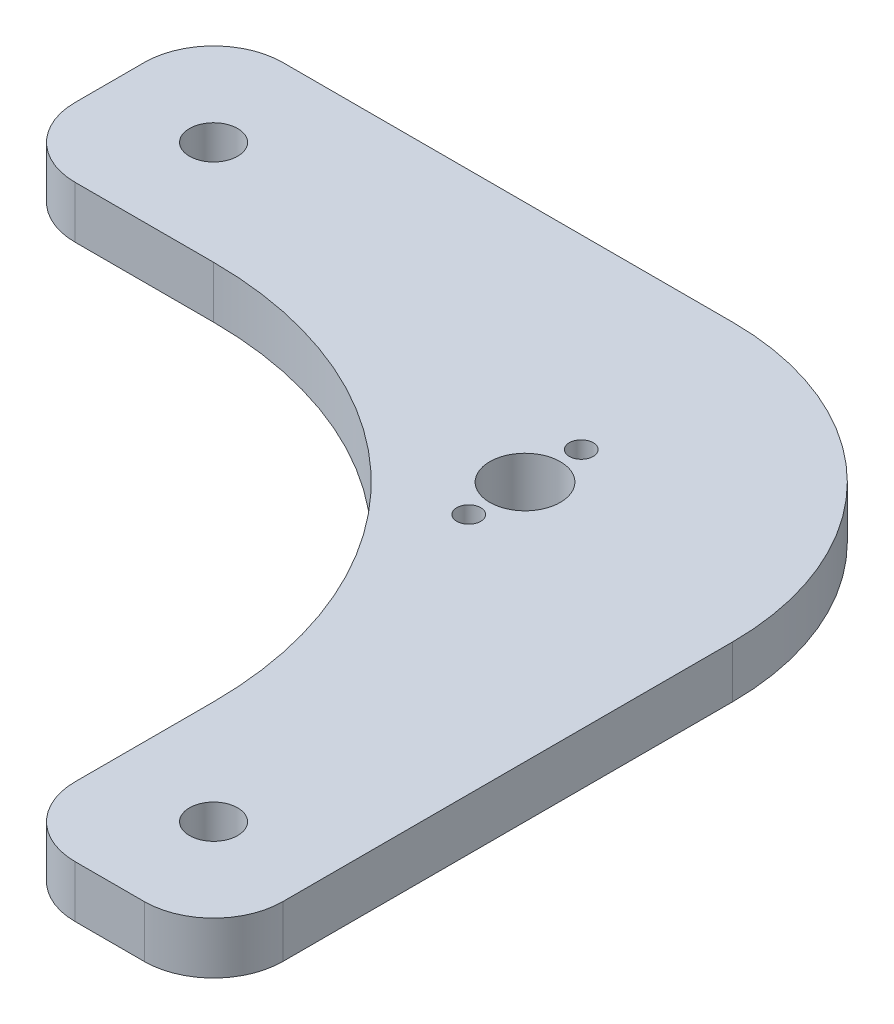
ISO-10303-21;
HEADER;
FILE_DESCRIPTION(('STEP AP214'),'2;1');
FILE_NAME('part.step','',(''),(''),'','','');
FILE_SCHEMA(('AUTOMOTIVE_DESIGN { 1 0 10303 214 1 1 1 1 }'));
ENDSEC;
DATA;
#1=APPLICATION_CONTEXT('core data for automotive mechanical design processes');
#2=APPLICATION_PROTOCOL_DEFINITION('international standard','automotive_design',2000,#1);
#3=PRODUCT_CONTEXT('',#1,'mechanical');
#4=PRODUCT('Part','Part','',(#3));
#5=PRODUCT_RELATED_PRODUCT_CATEGORY('part','',(#4));
#6=PRODUCT_DEFINITION_FORMATION('','',#4);
#7=PRODUCT_DEFINITION_CONTEXT('part definition',#1,'design');
#8=PRODUCT_DEFINITION('design','',#6,#7);
#9=PRODUCT_DEFINITION_SHAPE('','',#8);
#10=(LENGTH_UNIT() NAMED_UNIT(*) SI_UNIT(.MILLI.,.METRE.));
#11=(NAMED_UNIT(*) PLANE_ANGLE_UNIT() SI_UNIT($,.RADIAN.));
#12=(NAMED_UNIT(*) SI_UNIT($,.STERADIAN.) SOLID_ANGLE_UNIT());
#13=UNCERTAINTY_MEASURE_WITH_UNIT(LENGTH_MEASURE(1.E-05),#10,'distance_accuracy_value','');
#14=(GEOMETRIC_REPRESENTATION_CONTEXT(3) GLOBAL_UNCERTAINTY_ASSIGNED_CONTEXT((#13)) GLOBAL_UNIT_ASSIGNED_CONTEXT((#10,
#11,#12)) REPRESENTATION_CONTEXT('',''));
#15=CARTESIAN_POINT('',(0.,0.,0.));
#16=DIRECTION('',(0.,0.,1.));
#17=DIRECTION('',(1.,0.,0.));
#18=AXIS2_PLACEMENT_3D('',#15,#16,#17);
#19=CARTESIAN_POINT('',(0.,4.7625,0.));
#20=DIRECTION('',(0.,0.,-1.));
#21=DIRECTION('',(-1.,0.,0.));
#22=AXIS2_PLACEMENT_3D('',#19,#20,#21);
#23=PLANE('',#22);
#24=DIRECTION('',(1.,0.,0.));
#25=VECTOR('',#24,1.);
#26=CARTESIAN_POINT('',(0.,4.7625,0.));
#27=LINE('',#26,#25);
#28=CARTESIAN_POINT('',(120.65,4.7625,0.));
#29=VERTEX_POINT('',#28);
#30=CARTESIAN_POINT('',(133.35,4.7625,0.));
#31=VERTEX_POINT('',#30);
#32=EDGE_CURVE('E188',#29,#31,#27,.T.);
#33=ORIENTED_EDGE('',*,*,#32,.F.);
#34=DIRECTION('',(0.,1.,0.));
#35=VECTOR('',#34,1.);
#36=CARTESIAN_POINT('',(120.65,4.7625,0.));
#37=LINE('',#36,#35);
#38=CARTESIAN_POINT('',(120.65,-4.7625,0.));
#39=VERTEX_POINT('',#38);
#40=EDGE_CURVE('E220',#29,#39,#37,.F.);
#41=ORIENTED_EDGE('',*,*,#40,.T.);
#42=DIRECTION('',(1.,0.,0.));
#43=VECTOR('',#42,1.);
#44=CARTESIAN_POINT('',(0.,-4.7625,0.));
#45=LINE('',#44,#43);
#46=CARTESIAN_POINT('',(133.35,-4.7625,0.));
#47=VERTEX_POINT('',#46);
#48=EDGE_CURVE('E185',#39,#47,#45,.T.);
#49=ORIENTED_EDGE('',*,*,#48,.T.);
#50=DIRECTION('',(0.,-1.,0.));
#51=VECTOR('',#50,1.);
#52=CARTESIAN_POINT('',(133.35,4.7625,0.));
#53=LINE('',#52,#51);
#54=EDGE_CURVE('E218',#47,#31,#53,.F.);
#55=ORIENTED_EDGE('',*,*,#54,.T.);
#56=EDGE_LOOP('',(#33,#41,#49,#55));
#57=FACE_BOUND('',#56,.T.);
#58=ADVANCED_FACE('F34',(#57),#23,.F.);
#59=CARTESIAN_POINT('',(146.05,4.7625,-146.05));
#60=DIRECTION('',(-1.,0.,0.));
#61=DIRECTION('',(0.,0.,1.));
#62=AXIS2_PLACEMENT_3D('',#59,#60,#61);
#63=PLANE('',#62);
#64=DIRECTION('',(0.,0.,-1.));
#65=VECTOR('',#64,1.);
#66=CARTESIAN_POINT('',(146.05,-4.7625,-146.05));
#67=LINE('',#66,#65);
#68=CARTESIAN_POINT('',(146.05,-4.7625,-12.7));
#69=VERTEX_POINT('',#68);
#70=CARTESIAN_POINT('',(146.05,-4.7625,-95.25));
#71=VERTEX_POINT('',#70);
#72=EDGE_CURVE('E202',#69,#71,#67,.T.);
#73=ORIENTED_EDGE('',*,*,#72,.T.);
#74=DIRECTION('',(0.,-1.,0.));
#75=VECTOR('',#74,1.);
#76=CARTESIAN_POINT('',(146.05,4.7625,-95.25));
#77=LINE('',#76,#75);
#78=CARTESIAN_POINT('',(146.05,4.7625,-95.25));
#79=VERTEX_POINT('',#78);
#80=EDGE_CURVE('E42',#71,#79,#77,.F.);
#81=ORIENTED_EDGE('',*,*,#80,.T.);
#82=DIRECTION('',(0.,0.,-1.));
#83=VECTOR('',#82,1.);
#84=CARTESIAN_POINT('',(146.05,4.7625,-146.05));
#85=LINE('',#84,#83);
#86=CARTESIAN_POINT('',(146.05,4.7625,-12.7));
#87=VERTEX_POINT('',#86);
#88=EDGE_CURVE('E191',#87,#79,#85,.T.);
#89=ORIENTED_EDGE('',*,*,#88,.F.);
#90=DIRECTION('',(0.,-1.,0.));
#91=VECTOR('',#90,1.);
#92=CARTESIAN_POINT('',(146.05,4.7625,-12.7));
#93=LINE('',#92,#91);
#94=EDGE_CURVE('E241',#87,#69,#93,.T.);
#95=ORIENTED_EDGE('',*,*,#94,.T.);
#96=EDGE_LOOP('',(#73,#81,#89,#95));
#97=FACE_BOUND('',#96,.T.);
#98=ADVANCED_FACE('F283',(#97),#63,.F.);
#99=CARTESIAN_POINT('',(0.,4.7625,-146.05));
#100=DIRECTION('',(0.,0.,1.));
#101=DIRECTION('',(1.,0.,0.));
#102=AXIS2_PLACEMENT_3D('',#99,#100,#101);
#103=PLANE('',#102);
#104=DIRECTION('',(-1.,0.,0.));
#105=VECTOR('',#104,1.);
#106=CARTESIAN_POINT('',(0.,4.7625,-146.05));
#107=LINE('',#106,#105);
#108=CARTESIAN_POINT('',(95.25,4.7625,-146.05));
#109=VERTEX_POINT('',#108);
#110=CARTESIAN_POINT('',(12.7,4.7625,-146.05));
#111=VERTEX_POINT('',#110);
#112=EDGE_CURVE('E194',#109,#111,#107,.T.);
#113=ORIENTED_EDGE('',*,*,#112,.F.);
#114=DIRECTION('',(0.,-1.,0.));
#115=VECTOR('',#114,1.);
#116=CARTESIAN_POINT('',(95.25,4.7625,-146.05));
#117=LINE('',#116,#115);
#118=CARTESIAN_POINT('',(95.25,-4.7625,-146.05));
#119=VERTEX_POINT('',#118);
#120=EDGE_CURVE('E244',#109,#119,#117,.T.);
#121=ORIENTED_EDGE('',*,*,#120,.T.);
#122=DIRECTION('',(-1.,0.,0.));
#123=VECTOR('',#122,1.);
#124=CARTESIAN_POINT('',(0.,-4.7625,-146.05));
#125=LINE('',#124,#123);
#126=CARTESIAN_POINT('',(12.7,-4.7625,-146.05));
#127=VERTEX_POINT('',#126);
#128=EDGE_CURVE('E204',#119,#127,#125,.T.);
#129=ORIENTED_EDGE('',*,*,#128,.T.);
#130=DIRECTION('',(0.,-1.,0.));
#131=VECTOR('',#130,1.);
#132=CARTESIAN_POINT('',(12.7,4.7625,-146.05));
#133=LINE('',#132,#131);
#134=EDGE_CURVE('E238',#127,#111,#133,.F.);
#135=ORIENTED_EDGE('',*,*,#134,.T.);
#136=EDGE_LOOP('',(#113,#121,#129,#135));
#137=FACE_BOUND('',#136,.T.);
#138=ADVANCED_FACE('F250',(#137),#103,.F.);
#139=CARTESIAN_POINT('',(0.,4.7625,-146.05));
#140=DIRECTION('',(1.,0.,0.));
#141=DIRECTION('',(0.,0.,-1.));
#142=AXIS2_PLACEMENT_3D('',#139,#140,#141);
#143=PLANE('',#142);
#144=DIRECTION('',(0.,0.,1.));
#145=VECTOR('',#144,1.);
#146=CARTESIAN_POINT('',(0.,-4.7625,-146.05));
#147=LINE('',#146,#145);
#148=CARTESIAN_POINT('',(0.,-4.7625,-133.35));
#149=VERTEX_POINT('',#148);
#150=CARTESIAN_POINT('',(0.,-4.7625,-120.65));
#151=VERTEX_POINT('',#150);
#152=EDGE_CURVE('E192',#149,#151,#147,.T.);
#153=ORIENTED_EDGE('',*,*,#152,.T.);
#154=DIRECTION('',(0.,1.,0.));
#155=VECTOR('',#154,1.);
#156=CARTESIAN_POINT('',(0.,4.7625,-120.65));
#157=LINE('',#156,#155);
#158=CARTESIAN_POINT('',(0.,4.7625,-120.65));
#159=VERTEX_POINT('',#158);
#160=EDGE_CURVE('E234',#151,#159,#157,.T.);
#161=ORIENTED_EDGE('',*,*,#160,.T.);
#162=DIRECTION('',(0.,0.,1.));
#163=VECTOR('',#162,1.);
#164=CARTESIAN_POINT('',(0.,4.7625,-146.05));
#165=LINE('',#164,#163);
#166=CARTESIAN_POINT('',(0.,4.7625,-133.35));
#167=VERTEX_POINT('',#166);
#168=EDGE_CURVE('E196',#167,#159,#165,.T.);
#169=ORIENTED_EDGE('',*,*,#168,.F.);
#170=DIRECTION('',(0.,-1.,0.));
#171=VECTOR('',#170,1.);
#172=CARTESIAN_POINT('',(0.,4.7625,-133.35));
#173=LINE('',#172,#171);
#174=EDGE_CURVE('E231',#167,#149,#173,.T.);
#175=ORIENTED_EDGE('',*,*,#174,.T.);
#176=EDGE_LOOP('',(#153,#161,#169,#175));
#177=FACE_BOUND('',#176,.T.);
#178=ADVANCED_FACE('F263',(#177),#143,.F.);
#179=CARTESIAN_POINT('',(0.,4.7625,0.));
#180=DIRECTION('',(0.,-1.,0.));
#181=DIRECTION('',(0.,0.,-1.));
#182=AXIS2_PLACEMENT_3D('',#179,#180,#181);
#183=PLANE('',#182);
#184=CARTESIAN_POINT('',(19.05,4.7625,-127.));
#185=DIRECTION('',(0.,1.,0.));
#186=DIRECTION('',(0.,0.,1.));
#187=AXIS2_PLACEMENT_3D('',#184,#185,#186);
#188=CIRCLE('',#187,4.4196);
#189=CARTESIAN_POINT('',(19.05,4.7625,-122.5804));
#190=VERTEX_POINT('',#189);
#191=EDGE_CURVE('E135',#190,#190,#188,.T.);
#192=ORIENTED_EDGE('',*,*,#191,.F.);
#193=EDGE_LOOP('',(#192));
#194=FACE_BOUND('',#193,.T.);
#195=CARTESIAN_POINT('',(127.,4.7625,-19.05));
#196=DIRECTION('',(0.,1.,0.));
#197=DIRECTION('',(0.,0.,1.));
#198=AXIS2_PLACEMENT_3D('',#195,#196,#197);
#199=CIRCLE('',#198,4.4196);
#200=CARTESIAN_POINT('',(127.,4.7625,-14.6304));
#201=VERTEX_POINT('',#200);
#202=EDGE_CURVE('E163',#201,#201,#199,.T.);
#203=ORIENTED_EDGE('',*,*,#202,.F.);
#204=EDGE_LOOP('',(#203));
#205=FACE_BOUND('',#204,.T.);
#206=CARTESIAN_POINT('',(101.6,4.7625,-91.28125));
#207=DIRECTION('',(0.,1.,0.));
#208=DIRECTION('',(0.,0.,1.));
#209=AXIS2_PLACEMENT_3D('',#206,#207,#208);
#210=CIRCLE('',#209,2.19075000000001);
#211=CARTESIAN_POINT('',(101.6,4.7625,-89.0905));
#212=VERTEX_POINT('',#211);
#213=EDGE_CURVE('E174',#212,#212,#210,.T.);
#214=ORIENTED_EDGE('',*,*,#213,.F.);
#215=EDGE_LOOP('',(#214));
#216=FACE_BOUND('',#215,.T.);
#217=CARTESIAN_POINT('',(101.6,4.7625,-111.91875));
#218=DIRECTION('',(0.,1.,0.));
#219=DIRECTION('',(0.,0.,1.));
#220=AXIS2_PLACEMENT_3D('',#217,#218,#219);
#221=CIRCLE('',#220,2.19075000000001);
#222=CARTESIAN_POINT('',(101.6,4.7625,-109.728));
#223=VERTEX_POINT('',#222);
#224=EDGE_CURVE('E169',#223,#223,#221,.T.);
#225=ORIENTED_EDGE('',*,*,#224,.F.);
#226=EDGE_LOOP('',(#225));
#227=FACE_BOUND('',#226,.T.);
#228=CARTESIAN_POINT('',(101.6,4.7625,-101.6));
#229=DIRECTION('',(0.,1.,0.));
#230=DIRECTION('',(0.,0.,1.));
#231=AXIS2_PLACEMENT_3D('',#228,#229,#230);
#232=CIRCLE('',#231,6.477);
#233=CARTESIAN_POINT('',(101.6,4.7625,-95.123));
#234=VERTEX_POINT('',#233);
#235=EDGE_CURVE('E173',#234,#234,#232,.T.);
#236=ORIENTED_EDGE('',*,*,#235,.F.);
#237=EDGE_LOOP('',(#236));
#238=FACE_BOUND('',#237,.T.);
#239=ORIENTED_EDGE('',*,*,#88,.T.);
#240=CARTESIAN_POINT('',(95.25,4.7625,-95.25));
#241=DIRECTION('',(0.,-1.,0.));
#242=DIRECTION('',(0.,0.,-1.));
#243=AXIS2_PLACEMENT_3D('',#240,#241,#242);
#244=CIRCLE('',#243,50.8);
#245=EDGE_CURVE('E11',#79,#109,#244,.F.);
#246=ORIENTED_EDGE('',*,*,#245,.T.);
#247=ORIENTED_EDGE('',*,*,#112,.T.);
#248=CARTESIAN_POINT('',(12.7,4.7625,-133.35));
#249=DIRECTION('',(0.,-1.,0.));
#250=DIRECTION('',(0.,0.,-1.));
#251=AXIS2_PLACEMENT_3D('',#248,#249,#250);
#252=CIRCLE('',#251,12.7);
#253=EDGE_CURVE('E212',#111,#167,#252,.F.);
#254=ORIENTED_EDGE('',*,*,#253,.T.);
#255=ORIENTED_EDGE('',*,*,#168,.T.);
#256=CARTESIAN_POINT('',(12.7,4.7625,-120.65));
#257=DIRECTION('',(0.,-1.,0.));
#258=DIRECTION('',(0.,0.,-1.));
#259=AXIS2_PLACEMENT_3D('',#256,#257,#258);
#260=CIRCLE('',#259,12.7);
#261=CARTESIAN_POINT('',(12.7,4.7625,-107.95));
#262=VERTEX_POINT('',#261);
#263=EDGE_CURVE('E214',#159,#262,#260,.F.);
#264=ORIENTED_EDGE('',*,*,#263,.T.);
#265=DIRECTION('',(-1.,0.,0.));
#266=VECTOR('',#265,1.);
#267=CARTESIAN_POINT('',(0.,4.7625,-107.95));
#268=LINE('',#267,#266);
#269=CARTESIAN_POINT('',(38.1,4.7625,-107.95));
#270=VERTEX_POINT('',#269);
#271=EDGE_CURVE('E150',#270,#262,#268,.T.);
#272=ORIENTED_EDGE('',*,*,#271,.F.);
#273=CARTESIAN_POINT('',(38.1,4.7625,-38.1));
#274=DIRECTION('',(0.,1.,0.));
#275=DIRECTION('',(0.,0.,-1.));
#276=AXIS2_PLACEMENT_3D('',#273,#274,#275);
#277=CIRCLE('',#276,69.85);
#278=CARTESIAN_POINT('',(107.95,4.7625,-38.1));
#279=VERTEX_POINT('',#278);
#280=EDGE_CURVE('E131',#279,#270,#277,.T.);
#281=ORIENTED_EDGE('',*,*,#280,.F.);
#282=DIRECTION('',(0.,0.,-1.));
#283=VECTOR('',#282,1.);
#284=CARTESIAN_POINT('',(107.95,4.7625,0.));
#285=LINE('',#284,#283);
#286=CARTESIAN_POINT('',(107.95,4.7625,-12.7));
#287=VERTEX_POINT('',#286);
#288=EDGE_CURVE('E153',#287,#279,#285,.T.);
#289=ORIENTED_EDGE('',*,*,#288,.F.);
#290=CARTESIAN_POINT('',(120.65,4.7625,-12.7));
#291=DIRECTION('',(0.,-1.,0.));
#292=DIRECTION('',(0.,0.,-1.));
#293=AXIS2_PLACEMENT_3D('',#290,#291,#292);
#294=CIRCLE('',#293,12.7);
#295=EDGE_CURVE('E216',#287,#29,#294,.F.);
#296=ORIENTED_EDGE('',*,*,#295,.T.);
#297=ORIENTED_EDGE('',*,*,#32,.T.);
#298=CARTESIAN_POINT('',(133.35,4.7625,-12.7));
#299=DIRECTION('',(0.,-1.,0.));
#300=DIRECTION('',(0.,0.,-1.));
#301=AXIS2_PLACEMENT_3D('',#298,#299,#300);
#302=CIRCLE('',#301,12.7);
#303=EDGE_CURVE('E210',#31,#87,#302,.F.);
#304=ORIENTED_EDGE('',*,*,#303,.T.);
#305=EDGE_LOOP('',(#239,#246,#247,#254,#255,#264,#272,#281,#289,#296,#297,#304));
#306=FACE_BOUND('',#305,.T.);
#307=ADVANCED_FACE('F261',(#194,#205,#216,#227,#238,#306),#183,.F.);
#308=CARTESIAN_POINT('',(0.,-4.7625,0.));
#309=DIRECTION('',(0.,-1.,0.));
#310=DIRECTION('',(0.,0.,-1.));
#311=AXIS2_PLACEMENT_3D('',#308,#309,#310);
#312=PLANE('',#311);
#313=ORIENTED_EDGE('',*,*,#128,.F.);
#314=CARTESIAN_POINT('',(95.25,-4.7625,-95.25));
#315=DIRECTION('',(0.,-1.,0.));
#316=DIRECTION('',(0.,0.,-1.));
#317=AXIS2_PLACEMENT_3D('',#314,#315,#316);
#318=CIRCLE('',#317,50.8);
#319=EDGE_CURVE('E56',#119,#71,#318,.T.);
#320=ORIENTED_EDGE('',*,*,#319,.T.);
#321=ORIENTED_EDGE('',*,*,#72,.F.);
#322=CARTESIAN_POINT('',(133.35,-4.7625,-12.7));
#323=DIRECTION('',(0.,-1.,0.));
#324=DIRECTION('',(0.,0.,-1.));
#325=AXIS2_PLACEMENT_3D('',#322,#323,#324);
#326=CIRCLE('',#325,12.7);
#327=EDGE_CURVE('E222',#69,#47,#326,.T.);
#328=ORIENTED_EDGE('',*,*,#327,.T.);
#329=ORIENTED_EDGE('',*,*,#48,.F.);
#330=CARTESIAN_POINT('',(120.65,-4.7625,-12.7));
#331=DIRECTION('',(0.,-1.,0.));
#332=DIRECTION('',(0.,0.,-1.));
#333=AXIS2_PLACEMENT_3D('',#330,#331,#332);
#334=CIRCLE('',#333,12.7);
#335=CARTESIAN_POINT('',(107.95,-4.7625,-12.7));
#336=VERTEX_POINT('',#335);
#337=EDGE_CURVE('E229',#39,#336,#334,.T.);
#338=ORIENTED_EDGE('',*,*,#337,.T.);
#339=DIRECTION('',(0.,0.,-1.));
#340=VECTOR('',#339,1.);
#341=CARTESIAN_POINT('',(107.95,-4.7625,0.));
#342=LINE('',#341,#340);
#343=CARTESIAN_POINT('',(107.95,-4.7625,-38.1));
#344=VERTEX_POINT('',#343);
#345=EDGE_CURVE('E148',#336,#344,#342,.T.);
#346=ORIENTED_EDGE('',*,*,#345,.T.);
#347=CARTESIAN_POINT('',(38.1,-4.7625,-38.1));
#348=DIRECTION('',(0.,1.,0.));
#349=DIRECTION('',(0.,0.,-1.));
#350=AXIS2_PLACEMENT_3D('',#347,#348,#349);
#351=CIRCLE('',#350,69.85);
#352=CARTESIAN_POINT('',(38.1,-4.7625,-107.95));
#353=VERTEX_POINT('',#352);
#354=EDGE_CURVE('E128',#344,#353,#351,.T.);
#355=ORIENTED_EDGE('',*,*,#354,.T.);
#356=DIRECTION('',(-1.,0.,0.));
#357=VECTOR('',#356,1.);
#358=CARTESIAN_POINT('',(0.,-4.7625,-107.95));
#359=LINE('',#358,#357);
#360=CARTESIAN_POINT('',(12.7,-4.7625,-107.95));
#361=VERTEX_POINT('',#360);
#362=EDGE_CURVE('E139',#353,#361,#359,.T.);
#363=ORIENTED_EDGE('',*,*,#362,.T.);
#364=CARTESIAN_POINT('',(12.7,-4.7625,-120.65));
#365=DIRECTION('',(0.,-1.,0.));
#366=DIRECTION('',(0.,0.,-1.));
#367=AXIS2_PLACEMENT_3D('',#364,#365,#366);
#368=CIRCLE('',#367,12.7);
#369=EDGE_CURVE('E227',#361,#151,#368,.T.);
#370=ORIENTED_EDGE('',*,*,#369,.T.);
#371=ORIENTED_EDGE('',*,*,#152,.F.);
#372=CARTESIAN_POINT('',(12.7,-4.7625,-133.35));
#373=DIRECTION('',(0.,-1.,0.));
#374=DIRECTION('',(0.,0.,-1.));
#375=AXIS2_PLACEMENT_3D('',#372,#373,#374);
#376=CIRCLE('',#375,12.7);
#377=EDGE_CURVE('E224',#149,#127,#376,.T.);
#378=ORIENTED_EDGE('',*,*,#377,.T.);
#379=EDGE_LOOP('',(#313,#320,#321,#328,#329,#338,#346,#355,#363,#370,#371,#378));
#380=FACE_BOUND('',#379,.T.);
#381=CARTESIAN_POINT('',(19.05,-4.7625,-127.));
#382=DIRECTION('',(0.,1.,0.));
#383=DIRECTION('',(0.,0.,1.));
#384=AXIS2_PLACEMENT_3D('',#381,#382,#383);
#385=CIRCLE('',#384,4.4196);
#386=CARTESIAN_POINT('',(19.05,-4.7625,-122.5804));
#387=VERTEX_POINT('',#386);
#388=EDGE_CURVE('E160',#387,#387,#385,.T.);
#389=ORIENTED_EDGE('',*,*,#388,.T.);
#390=EDGE_LOOP('',(#389));
#391=FACE_BOUND('',#390,.T.);
#392=CARTESIAN_POINT('',(127.,-4.7625,-19.05));
#393=DIRECTION('',(0.,1.,0.));
#394=DIRECTION('',(0.,0.,1.));
#395=AXIS2_PLACEMENT_3D('',#392,#393,#394);
#396=CIRCLE('',#395,4.4196);
#397=CARTESIAN_POINT('',(127.,-4.7625,-14.6304));
#398=VERTEX_POINT('',#397);
#399=EDGE_CURVE('E166',#398,#398,#396,.T.);
#400=ORIENTED_EDGE('',*,*,#399,.T.);
#401=EDGE_LOOP('',(#400));
#402=FACE_BOUND('',#401,.T.);
#403=CARTESIAN_POINT('',(101.6,-4.7625,-91.28125));
#404=DIRECTION('',(0.,1.,0.));
#405=DIRECTION('',(0.,0.,1.));
#406=AXIS2_PLACEMENT_3D('',#403,#404,#405);
#407=CIRCLE('',#406,2.19075000000001);
#408=CARTESIAN_POINT('',(101.6,-4.7625,-89.0905));
#409=VERTEX_POINT('',#408);
#410=EDGE_CURVE('E170',#409,#409,#407,.T.);
#411=ORIENTED_EDGE('',*,*,#410,.T.);
#412=EDGE_LOOP('',(#411));
#413=FACE_BOUND('',#412,.T.);
#414=CARTESIAN_POINT('',(101.6,-4.7625,-111.91875));
#415=DIRECTION('',(0.,1.,0.));
#416=DIRECTION('',(0.,0.,1.));
#417=AXIS2_PLACEMENT_3D('',#414,#415,#416);
#418=CIRCLE('',#417,2.19075000000001);
#419=CARTESIAN_POINT('',(101.6,-4.7625,-109.728));
#420=VERTEX_POINT('',#419);
#421=EDGE_CURVE('E177',#420,#420,#418,.T.);
#422=ORIENTED_EDGE('',*,*,#421,.T.);
#423=EDGE_LOOP('',(#422));
#424=FACE_BOUND('',#423,.T.);
#425=CARTESIAN_POINT('',(101.6,-4.7625,-101.6));
#426=DIRECTION('',(0.,1.,0.));
#427=DIRECTION('',(0.,0.,1.));
#428=AXIS2_PLACEMENT_3D('',#425,#426,#427);
#429=CIRCLE('',#428,6.477);
#430=CARTESIAN_POINT('',(101.6,-4.7625,-95.123));
#431=VERTEX_POINT('',#430);
#432=EDGE_CURVE('E182',#431,#431,#429,.T.);
#433=ORIENTED_EDGE('',*,*,#432,.T.);
#434=EDGE_LOOP('',(#433));
#435=FACE_BOUND('',#434,.T.);
#436=ADVANCED_FACE('F145',(#380,#391,#402,#413,#424,#435),#312,.T.);
#437=CARTESIAN_POINT('',(101.6,-4.7625,-101.6));
#438=DIRECTION('',(0.,1.,0.));
#439=DIRECTION('',(0.,0.,1.));
#440=AXIS2_PLACEMENT_3D('',#437,#438,#439);
#441=CYLINDRICAL_SURFACE('',#440,6.477);
#442=CARTESIAN_POINT('',(101.6,-4.7625,-95.123));
#443=CARTESIAN_POINT('',(101.6,-4.66328125,-95.123));
#444=CARTESIAN_POINT('',(101.6,-4.5640625,-95.123));
#445=CARTESIAN_POINT('',(101.6,-4.365625,-95.123));
#446=CARTESIAN_POINT('',(101.6,-4.26640625,-95.123));
#447=CARTESIAN_POINT('',(101.6,-4.06796875,-95.123));
#448=CARTESIAN_POINT('',(101.6,-3.96875,-95.123));
#449=CARTESIAN_POINT('',(101.6,-3.7703125,-95.123));
#450=CARTESIAN_POINT('',(101.6,-3.67109375,-95.123));
#451=CARTESIAN_POINT('',(101.6,-3.47265625,-95.123));
#452=CARTESIAN_POINT('',(101.6,-3.3734375,-95.123));
#453=CARTESIAN_POINT('',(101.6,-3.175,-95.123));
#454=CARTESIAN_POINT('',(101.6,-3.07578125,-95.123));
#455=CARTESIAN_POINT('',(101.6,-2.87734375,-95.123));
#456=CARTESIAN_POINT('',(101.6,-2.778125,-95.123));
#457=CARTESIAN_POINT('',(101.6,-2.5796875,-95.123));
#458=CARTESIAN_POINT('',(101.6,-2.48046875,-95.123));
#459=CARTESIAN_POINT('',(101.6,-2.28203125,-95.123));
#460=CARTESIAN_POINT('',(101.6,-2.1828125,-95.123));
#461=CARTESIAN_POINT('',(101.6,-1.984375,-95.123));
#462=CARTESIAN_POINT('',(101.6,-1.88515625,-95.123));
#463=CARTESIAN_POINT('',(101.6,-1.68671875,-95.123));
#464=CARTESIAN_POINT('',(101.6,-1.5875,-95.123));
#465=CARTESIAN_POINT('',(101.6,-1.3890625,-95.123));
#466=CARTESIAN_POINT('',(101.6,-1.28984375,-95.123));
#467=CARTESIAN_POINT('',(101.6,-1.09140625,-95.123));
#468=CARTESIAN_POINT('',(101.6,-0.9921875,-95.123));
#469=CARTESIAN_POINT('',(101.6,-0.79375,-95.123));
#470=CARTESIAN_POINT('',(101.6,-0.69453125,-95.123));
#471=CARTESIAN_POINT('',(101.6,-0.49609375,-95.123));
#472=CARTESIAN_POINT('',(101.6,-0.396875,-95.123));
#473=CARTESIAN_POINT('',(101.6,-0.1984375,-95.123));
#474=CARTESIAN_POINT('',(101.6,-0.0992187500000001,-95.123));
#475=CARTESIAN_POINT('',(101.6,0.0992187500000001,-95.123));
#476=CARTESIAN_POINT('',(101.6,0.1984375,-95.123));
#477=CARTESIAN_POINT('',(101.6,0.396875,-95.123));
#478=CARTESIAN_POINT('',(101.6,0.49609375,-95.123));
#479=CARTESIAN_POINT('',(101.6,0.69453125,-95.123));
#480=CARTESIAN_POINT('',(101.6,0.793750000000001,-95.123));
#481=CARTESIAN_POINT('',(101.6,0.992187500000001,-95.123));
#482=CARTESIAN_POINT('',(101.6,1.09140625,-95.123));
#483=CARTESIAN_POINT('',(101.6,1.28984375,-95.123));
#484=CARTESIAN_POINT('',(101.6,1.3890625,-95.123));
#485=CARTESIAN_POINT('',(101.6,1.5875,-95.123));
#486=CARTESIAN_POINT('',(101.6,1.68671875,-95.123));
#487=CARTESIAN_POINT('',(101.6,1.88515625,-95.123));
#488=CARTESIAN_POINT('',(101.6,1.984375,-95.123));
#489=CARTESIAN_POINT('',(101.6,2.1828125,-95.123));
#490=CARTESIAN_POINT('',(101.6,2.28203125,-95.123));
#491=CARTESIAN_POINT('',(101.6,2.48046875,-95.123));
#492=CARTESIAN_POINT('',(101.6,2.5796875,-95.123));
#493=CARTESIAN_POINT('',(101.6,2.778125,-95.123));
#494=CARTESIAN_POINT('',(101.6,2.87734375,-95.123));
#495=CARTESIAN_POINT('',(101.6,3.07578125,-95.123));
#496=CARTESIAN_POINT('',(101.6,3.175,-95.123));
#497=CARTESIAN_POINT('',(101.6,3.3734375,-95.123));
#498=CARTESIAN_POINT('',(101.6,3.47265625,-95.123));
#499=CARTESIAN_POINT('',(101.6,3.67109375,-95.123));
#500=CARTESIAN_POINT('',(101.6,3.7703125,-95.123));
#501=CARTESIAN_POINT('',(101.6,3.96875,-95.123));
#502=CARTESIAN_POINT('',(101.6,4.06796875,-95.123));
#503=CARTESIAN_POINT('',(101.6,4.26640625,-95.123));
#504=CARTESIAN_POINT('',(101.6,4.365625,-95.123));
#505=CARTESIAN_POINT('',(101.6,4.5640625,-95.123));
#506=CARTESIAN_POINT('',(101.6,4.66328125,-95.123));
#507=CARTESIAN_POINT('',(101.6,4.7625,-95.123));
#508=B_SPLINE_CURVE_WITH_KNOTS('',3,(#442,#443,#444,#445,#446,#447,#448,#449,#450,#451,#452,
#453,#454,#455,#456,#457,#458,#459,#460,#461,#462,#463,#464,#465,#466,#467,#468,#469,#470,#471,
#472,#473,#474,#475,#476,#477,#478,#479,#480,#481,#482,#483,#484,#485,#486,#487,#488,#489,#490,
#491,#492,#493,#494,#495,#496,#497,#498,#499,#500,#501,#502,#503,#504,#505,#506,#507),
.UNSPECIFIED.,.F.,.F.,(4,2,2,2,2,2,2,2,2,2,2,2,2,2,2,2,2,2,2,2,2,2,2,2,2,2,2,2,2,2,2,2,4),(0.,
0.297656249999999,0.595312499999999,0.89296875,1.190625,1.48828125,1.7859375,2.08359375,2.38125,
2.67890625,2.9765625,3.27421875,3.571875,3.86953125,4.1671875,4.46484375,4.7625,5.06015625,
5.3578125,5.65546875,5.953125,6.25078125,6.5484375,6.84609375,7.14375,7.44140625,7.7390625,
8.03671875,8.334375,8.63203125,8.9296875,9.22734375,9.525),.UNSPECIFIED.);
#509=EDGE_CURVE('BSEAM343',#431,#234,#508,.T.);
#510=ORIENTED_EDGE('',*,*,#432,.F.);
#511=ORIENTED_EDGE('',*,*,#235,.T.);
#512=ORIENTED_EDGE('',*,*,#509,.T.);
#513=ORIENTED_EDGE('',*,*,#509,.F.);
#514=EDGE_LOOP('',(#510,#512,#511,#513));
#515=FACE_BOUND('',#514,.T.);
#516=ADVANCED_FACE('F343',(#515),#441,.F.);
#517=CARTESIAN_POINT('',(101.6,-4.7625,-111.91875));
#518=DIRECTION('',(0.,1.,0.));
#519=DIRECTION('',(0.,0.,1.));
#520=AXIS2_PLACEMENT_3D('',#517,#518,#519);
#521=CYLINDRICAL_SURFACE('',#520,2.19075000000001);
#522=CARTESIAN_POINT('',(101.6,-4.7625,-109.728));
#523=CARTESIAN_POINT('',(101.6,-4.66328125,-109.728));
#524=CARTESIAN_POINT('',(101.6,-4.5640625,-109.728));
#525=CARTESIAN_POINT('',(101.6,-4.365625,-109.728));
#526=CARTESIAN_POINT('',(101.6,-4.26640625,-109.728));
#527=CARTESIAN_POINT('',(101.6,-4.06796875,-109.728));
#528=CARTESIAN_POINT('',(101.6,-3.96875,-109.728));
#529=CARTESIAN_POINT('',(101.6,-3.7703125,-109.728));
#530=CARTESIAN_POINT('',(101.6,-3.67109375,-109.728));
#531=CARTESIAN_POINT('',(101.6,-3.47265625,-109.728));
#532=CARTESIAN_POINT('',(101.6,-3.3734375,-109.728));
#533=CARTESIAN_POINT('',(101.6,-3.175,-109.728));
#534=CARTESIAN_POINT('',(101.6,-3.07578125,-109.728));
#535=CARTESIAN_POINT('',(101.6,-2.87734375,-109.728));
#536=CARTESIAN_POINT('',(101.6,-2.778125,-109.728));
#537=CARTESIAN_POINT('',(101.6,-2.5796875,-109.728));
#538=CARTESIAN_POINT('',(101.6,-2.48046875,-109.728));
#539=CARTESIAN_POINT('',(101.6,-2.28203125,-109.728));
#540=CARTESIAN_POINT('',(101.6,-2.1828125,-109.728));
#541=CARTESIAN_POINT('',(101.6,-1.984375,-109.728));
#542=CARTESIAN_POINT('',(101.6,-1.88515625,-109.728));
#543=CARTESIAN_POINT('',(101.6,-1.68671875,-109.728));
#544=CARTESIAN_POINT('',(101.6,-1.5875,-109.728));
#545=CARTESIAN_POINT('',(101.6,-1.3890625,-109.728));
#546=CARTESIAN_POINT('',(101.6,-1.28984375,-109.728));
#547=CARTESIAN_POINT('',(101.6,-1.09140625,-109.728));
#548=CARTESIAN_POINT('',(101.6,-0.9921875,-109.728));
#549=CARTESIAN_POINT('',(101.6,-0.793750000000001,-109.728));
#550=CARTESIAN_POINT('',(101.6,-0.694531250000001,-109.728));
#551=CARTESIAN_POINT('',(101.6,-0.496093750000001,-109.728));
#552=CARTESIAN_POINT('',(101.6,-0.396875000000001,-109.728));
#553=CARTESIAN_POINT('',(101.6,-0.198437500000001,-109.728));
#554=CARTESIAN_POINT('',(101.6,-0.0992187500000009,-109.728));
#555=CARTESIAN_POINT('',(101.6,0.0992187499999992,-109.728));
#556=CARTESIAN_POINT('',(101.6,0.198437499999999,-109.728));
#557=CARTESIAN_POINT('',(101.6,0.396874999999999,-109.728));
#558=CARTESIAN_POINT('',(101.6,0.496093749999999,-109.728));
#559=CARTESIAN_POINT('',(101.6,0.694531249999999,-109.728));
#560=CARTESIAN_POINT('',(101.6,0.79375,-109.728));
#561=CARTESIAN_POINT('',(101.6,0.9921875,-109.728));
#562=CARTESIAN_POINT('',(101.6,1.09140625,-109.728));
#563=CARTESIAN_POINT('',(101.6,1.28984375,-109.728));
#564=CARTESIAN_POINT('',(101.6,1.3890625,-109.728));
#565=CARTESIAN_POINT('',(101.6,1.5875,-109.728));
#566=CARTESIAN_POINT('',(101.6,1.68671875,-109.728));
#567=CARTESIAN_POINT('',(101.6,1.88515625,-109.728));
#568=CARTESIAN_POINT('',(101.6,1.984375,-109.728));
#569=CARTESIAN_POINT('',(101.6,2.1828125,-109.728));
#570=CARTESIAN_POINT('',(101.6,2.28203125,-109.728));
#571=CARTESIAN_POINT('',(101.6,2.48046875,-109.728));
#572=CARTESIAN_POINT('',(101.6,2.5796875,-109.728));
#573=CARTESIAN_POINT('',(101.6,2.778125,-109.728));
#574=CARTESIAN_POINT('',(101.6,2.87734375,-109.728));
#575=CARTESIAN_POINT('',(101.6,3.07578125,-109.728));
#576=CARTESIAN_POINT('',(101.6,3.175,-109.728));
#577=CARTESIAN_POINT('',(101.6,3.3734375,-109.728));
#578=CARTESIAN_POINT('',(101.6,3.47265625,-109.728));
#579=CARTESIAN_POINT('',(101.6,3.67109375,-109.728));
#580=CARTESIAN_POINT('',(101.6,3.7703125,-109.728));
#581=CARTESIAN_POINT('',(101.6,3.96875,-109.728));
#582=CARTESIAN_POINT('',(101.6,4.06796875,-109.728));
#583=CARTESIAN_POINT('',(101.6,4.26640625,-109.728));
#584=CARTESIAN_POINT('',(101.6,4.365625,-109.728));
#585=CARTESIAN_POINT('',(101.6,4.5640625,-109.728));
#586=CARTESIAN_POINT('',(101.6,4.66328125,-109.728));
#587=CARTESIAN_POINT('',(101.6,4.7625,-109.728));
#588=B_SPLINE_CURVE_WITH_KNOTS('',3,(#522,#523,#524,#525,#526,#527,#528,#529,#530,#531,#532,
#533,#534,#535,#536,#537,#538,#539,#540,#541,#542,#543,#544,#545,#546,#547,#548,#549,#550,#551,
#552,#553,#554,#555,#556,#557,#558,#559,#560,#561,#562,#563,#564,#565,#566,#567,#568,#569,#570,
#571,#572,#573,#574,#575,#576,#577,#578,#579,#580,#581,#582,#583,#584,#585,#586,#587),
.UNSPECIFIED.,.F.,.F.,(4,2,2,2,2,2,2,2,2,2,2,2,2,2,2,2,2,2,2,2,2,2,2,2,2,2,2,2,2,2,2,2,4),(0.,
0.29765625,0.5953125,0.892968750000001,1.190625,1.48828125,1.7859375,2.08359375,2.38125,
2.67890625,2.9765625,3.27421875,3.571875,3.86953125,4.1671875,4.46484375,4.7625,5.06015625,
5.3578125,5.65546875,5.953125,6.25078125,6.5484375,6.84609375,7.14375,7.44140625,7.7390625,
8.03671875,8.334375,8.63203125,8.9296875,9.22734375,9.525),.UNSPECIFIED.);
#589=EDGE_CURVE('BSEAM356',#420,#223,#588,.T.);
#590=ORIENTED_EDGE('',*,*,#421,.F.);
#591=ORIENTED_EDGE('',*,*,#224,.T.);
#592=ORIENTED_EDGE('',*,*,#589,.T.);
#593=ORIENTED_EDGE('',*,*,#589,.F.);
#594=EDGE_LOOP('',(#590,#592,#591,#593));
#595=FACE_BOUND('',#594,.T.);
#596=ADVANCED_FACE('F356',(#595),#521,.F.);
#597=CARTESIAN_POINT('',(101.6,-4.7625,-91.28125));
#598=DIRECTION('',(0.,1.,0.));
#599=DIRECTION('',(0.,0.,1.));
#600=AXIS2_PLACEMENT_3D('',#597,#598,#599);
#601=CYLINDRICAL_SURFACE('',#600,2.19075000000001);
#602=CARTESIAN_POINT('',(101.6,-4.7625,-89.0905));
#603=CARTESIAN_POINT('',(101.6,-4.66328125,-89.0905));
#604=CARTESIAN_POINT('',(101.6,-4.5640625,-89.0905));
#605=CARTESIAN_POINT('',(101.6,-4.365625,-89.0905));
#606=CARTESIAN_POINT('',(101.6,-4.26640625,-89.0905));
#607=CARTESIAN_POINT('',(101.6,-4.06796875,-89.0905));
#608=CARTESIAN_POINT('',(101.6,-3.96875,-89.0905));
#609=CARTESIAN_POINT('',(101.6,-3.7703125,-89.0905));
#610=CARTESIAN_POINT('',(101.6,-3.67109375,-89.0905));
#611=CARTESIAN_POINT('',(101.6,-3.47265625,-89.0905));
#612=CARTESIAN_POINT('',(101.6,-3.3734375,-89.0905));
#613=CARTESIAN_POINT('',(101.6,-3.175,-89.0905));
#614=CARTESIAN_POINT('',(101.6,-3.07578125,-89.0905));
#615=CARTESIAN_POINT('',(101.6,-2.87734375,-89.0905));
#616=CARTESIAN_POINT('',(101.6,-2.778125,-89.0905));
#617=CARTESIAN_POINT('',(101.6,-2.5796875,-89.0905));
#618=CARTESIAN_POINT('',(101.6,-2.48046875,-89.0905));
#619=CARTESIAN_POINT('',(101.6,-2.28203125,-89.0905));
#620=CARTESIAN_POINT('',(101.6,-2.1828125,-89.0905));
#621=CARTESIAN_POINT('',(101.6,-1.984375,-89.0905));
#622=CARTESIAN_POINT('',(101.6,-1.88515625,-89.0905));
#623=CARTESIAN_POINT('',(101.6,-1.68671875,-89.0905));
#624=CARTESIAN_POINT('',(101.6,-1.5875,-89.0905));
#625=CARTESIAN_POINT('',(101.6,-1.3890625,-89.0905));
#626=CARTESIAN_POINT('',(101.6,-1.28984375,-89.0905));
#627=CARTESIAN_POINT('',(101.6,-1.09140625,-89.0905));
#628=CARTESIAN_POINT('',(101.6,-0.9921875,-89.0905));
#629=CARTESIAN_POINT('',(101.6,-0.793750000000001,-89.0905));
#630=CARTESIAN_POINT('',(101.6,-0.694531250000001,-89.0905));
#631=CARTESIAN_POINT('',(101.6,-0.496093750000001,-89.0905));
#632=CARTESIAN_POINT('',(101.6,-0.396875000000001,-89.0905));
#633=CARTESIAN_POINT('',(101.6,-0.198437500000001,-89.0905));
#634=CARTESIAN_POINT('',(101.6,-0.0992187500000009,-89.0905));
#635=CARTESIAN_POINT('',(101.6,0.0992187499999992,-89.0905));
#636=CARTESIAN_POINT('',(101.6,0.198437499999999,-89.0905));
#637=CARTESIAN_POINT('',(101.6,0.396874999999999,-89.0905));
#638=CARTESIAN_POINT('',(101.6,0.496093749999999,-89.0905));
#639=CARTESIAN_POINT('',(101.6,0.694531249999999,-89.0905));
#640=CARTESIAN_POINT('',(101.6,0.79375,-89.0905));
#641=CARTESIAN_POINT('',(101.6,0.9921875,-89.0905));
#642=CARTESIAN_POINT('',(101.6,1.09140625,-89.0905));
#643=CARTESIAN_POINT('',(101.6,1.28984375,-89.0905));
#644=CARTESIAN_POINT('',(101.6,1.3890625,-89.0905));
#645=CARTESIAN_POINT('',(101.6,1.5875,-89.0905));
#646=CARTESIAN_POINT('',(101.6,1.68671875,-89.0905));
#647=CARTESIAN_POINT('',(101.6,1.88515625,-89.0905));
#648=CARTESIAN_POINT('',(101.6,1.984375,-89.0905));
#649=CARTESIAN_POINT('',(101.6,2.1828125,-89.0905));
#650=CARTESIAN_POINT('',(101.6,2.28203125,-89.0905));
#651=CARTESIAN_POINT('',(101.6,2.48046875,-89.0905));
#652=CARTESIAN_POINT('',(101.6,2.5796875,-89.0905));
#653=CARTESIAN_POINT('',(101.6,2.778125,-89.0905));
#654=CARTESIAN_POINT('',(101.6,2.87734375,-89.0905));
#655=CARTESIAN_POINT('',(101.6,3.07578125,-89.0905));
#656=CARTESIAN_POINT('',(101.6,3.175,-89.0905));
#657=CARTESIAN_POINT('',(101.6,3.3734375,-89.0905));
#658=CARTESIAN_POINT('',(101.6,3.47265625,-89.0905));
#659=CARTESIAN_POINT('',(101.6,3.67109375,-89.0905));
#660=CARTESIAN_POINT('',(101.6,3.7703125,-89.0905));
#661=CARTESIAN_POINT('',(101.6,3.96875,-89.0905));
#662=CARTESIAN_POINT('',(101.6,4.06796875,-89.0905));
#663=CARTESIAN_POINT('',(101.6,4.26640625,-89.0905));
#664=CARTESIAN_POINT('',(101.6,4.365625,-89.0905));
#665=CARTESIAN_POINT('',(101.6,4.5640625,-89.0905));
#666=CARTESIAN_POINT('',(101.6,4.66328125,-89.0905));
#667=CARTESIAN_POINT('',(101.6,4.7625,-89.0905));
#668=B_SPLINE_CURVE_WITH_KNOTS('',3,(#602,#603,#604,#605,#606,#607,#608,#609,#610,#611,#612,
#613,#614,#615,#616,#617,#618,#619,#620,#621,#622,#623,#624,#625,#626,#627,#628,#629,#630,#631,
#632,#633,#634,#635,#636,#637,#638,#639,#640,#641,#642,#643,#644,#645,#646,#647,#648,#649,#650,
#651,#652,#653,#654,#655,#656,#657,#658,#659,#660,#661,#662,#663,#664,#665,#666,#667),
.UNSPECIFIED.,.F.,.F.,(4,2,2,2,2,2,2,2,2,2,2,2,2,2,2,2,2,2,2,2,2,2,2,2,2,2,2,2,2,2,2,2,4),(0.,
0.29765625,0.5953125,0.892968750000001,1.190625,1.48828125,1.7859375,2.08359375,2.38125,
2.67890625,2.9765625,3.27421875,3.571875,3.86953125,4.1671875,4.46484375,4.7625,5.06015625,
5.3578125,5.65546875,5.953125,6.25078125,6.5484375,6.84609375,7.14375,7.44140625,7.7390625,
8.03671875,8.334375,8.63203125,8.9296875,9.22734375,9.525),.UNSPECIFIED.);
#669=EDGE_CURVE('BSEAM363',#409,#212,#668,.T.);
#670=ORIENTED_EDGE('',*,*,#410,.F.);
#671=ORIENTED_EDGE('',*,*,#213,.T.);
#672=ORIENTED_EDGE('',*,*,#669,.T.);
#673=ORIENTED_EDGE('',*,*,#669,.F.);
#674=EDGE_LOOP('',(#670,#672,#671,#673));
#675=FACE_BOUND('',#674,.T.);
#676=ADVANCED_FACE('F363',(#675),#601,.F.);
#677=CARTESIAN_POINT('',(127.,4.7625,-19.05));
#678=DIRECTION('',(0.,1.,0.));
#679=DIRECTION('',(0.,0.,1.));
#680=AXIS2_PLACEMENT_3D('',#677,#678,#679);
#681=CYLINDRICAL_SURFACE('',#680,4.4196);
#682=ORIENTED_EDGE('',*,*,#399,.F.);
#683=EDGE_LOOP('',(#682));
#684=FACE_BOUND('',#683,.T.);
#685=ORIENTED_EDGE('',*,*,#202,.T.);
#686=EDGE_LOOP('',(#685));
#687=FACE_BOUND('',#686,.T.);
#688=ADVANCED_FACE('F371',(#684,#687),#681,.F.);
#689=CARTESIAN_POINT('',(19.05,4.7625,-127.));
#690=DIRECTION('',(0.,1.,0.));
#691=DIRECTION('',(0.,0.,1.));
#692=AXIS2_PLACEMENT_3D('',#689,#690,#691);
#693=CYLINDRICAL_SURFACE('',#692,4.4196);
#694=ORIENTED_EDGE('',*,*,#388,.F.);
#695=EDGE_LOOP('',(#694));
#696=FACE_BOUND('',#695,.T.);
#697=ORIENTED_EDGE('',*,*,#191,.T.);
#698=EDGE_LOOP('',(#697));
#699=FACE_BOUND('',#698,.T.);
#700=ADVANCED_FACE('F379',(#696,#699),#693,.F.);
#701=CARTESIAN_POINT('',(0.,-4.7625,-107.95));
#702=DIRECTION('',(0.,0.,-1.));
#703=DIRECTION('',(-1.,0.,0.));
#704=AXIS2_PLACEMENT_3D('',#701,#702,#703);
#705=PLANE('',#704);
#706=ORIENTED_EDGE('',*,*,#271,.T.);
#707=DIRECTION('',(0.,1.,0.));
#708=VECTOR('',#707,1.);
#709=CARTESIAN_POINT('',(12.7,-4.7625,-107.95));
#710=LINE('',#709,#708);
#711=EDGE_CURVE('E142',#262,#361,#710,.F.);
#712=ORIENTED_EDGE('',*,*,#711,.T.);
#713=ORIENTED_EDGE('',*,*,#362,.F.);
#714=DIRECTION('',(0.,1.,0.));
#715=VECTOR('',#714,1.);
#716=CARTESIAN_POINT('',(38.1,-4.7625,-107.95));
#717=LINE('',#716,#715);
#718=EDGE_CURVE('E123',#353,#270,#717,.T.);
#719=ORIENTED_EDGE('',*,*,#718,.T.);
#720=EDGE_LOOP('',(#706,#712,#713,#719));
#721=FACE_BOUND('',#720,.T.);
#722=ADVANCED_FACE('F140',(#721),#705,.F.);
#723=CARTESIAN_POINT('',(38.1,-4.7625,-38.1));
#724=DIRECTION('',(0.,1.,0.));
#725=DIRECTION('',(0.,0.,1.));
#726=AXIS2_PLACEMENT_3D('',#723,#724,#725);
#727=CYLINDRICAL_SURFACE('',#726,69.85);
#728=ORIENTED_EDGE('',*,*,#280,.T.);
#729=ORIENTED_EDGE('',*,*,#718,.F.);
#730=ORIENTED_EDGE('',*,*,#354,.F.);
#731=DIRECTION('',(0.,1.,0.));
#732=VECTOR('',#731,1.);
#733=CARTESIAN_POINT('',(107.95,-4.7625,-38.1));
#734=LINE('',#733,#732);
#735=EDGE_CURVE('E136',#344,#279,#734,.T.);
#736=ORIENTED_EDGE('',*,*,#735,.T.);
#737=EDGE_LOOP('',(#728,#729,#730,#736));
#738=FACE_BOUND('',#737,.T.);
#739=ADVANCED_FACE('F125',(#738),#727,.F.);
#740=CARTESIAN_POINT('',(107.95,-4.7625,0.));
#741=DIRECTION('',(1.,0.,0.));
#742=DIRECTION('',(0.,0.,-1.));
#743=AXIS2_PLACEMENT_3D('',#740,#741,#742);
#744=PLANE('',#743);
#745=ORIENTED_EDGE('',*,*,#345,.F.);
#746=DIRECTION('',(0.,1.,0.));
#747=VECTOR('',#746,1.);
#748=CARTESIAN_POINT('',(107.95,-4.7625,-12.7));
#749=LINE('',#748,#747);
#750=EDGE_CURVE('E199',#336,#287,#749,.T.);
#751=ORIENTED_EDGE('',*,*,#750,.T.);
#752=ORIENTED_EDGE('',*,*,#288,.T.);
#753=ORIENTED_EDGE('',*,*,#735,.F.);
#754=EDGE_LOOP('',(#745,#751,#752,#753));
#755=FACE_BOUND('',#754,.T.);
#756=ADVANCED_FACE('F270',(#755),#744,.F.);
#757=CARTESIAN_POINT('',(120.65,-4.7625,-12.7));
#758=DIRECTION('',(0.,1.,0.));
#759=DIRECTION('',(0.,0.,1.));
#760=AXIS2_PLACEMENT_3D('',#757,#758,#759);
#761=CYLINDRICAL_SURFACE('',#760,12.7);
#762=ORIENTED_EDGE('',*,*,#337,.F.);
#763=ORIENTED_EDGE('',*,*,#40,.F.);
#764=ORIENTED_EDGE('',*,*,#295,.F.);
#765=ORIENTED_EDGE('',*,*,#750,.F.);
#766=EDGE_LOOP('',(#762,#763,#764,#765));
#767=FACE_BOUND('',#766,.T.);
#768=ADVANCED_FACE('F274',(#767),#761,.T.);
#769=CARTESIAN_POINT('',(12.7,4.7625,-120.65));
#770=DIRECTION('',(0.,1.,0.));
#771=DIRECTION('',(0.,0.,1.));
#772=AXIS2_PLACEMENT_3D('',#769,#770,#771);
#773=CYLINDRICAL_SURFACE('',#772,12.7);
#774=ORIENTED_EDGE('',*,*,#369,.F.);
#775=ORIENTED_EDGE('',*,*,#711,.F.);
#776=ORIENTED_EDGE('',*,*,#263,.F.);
#777=ORIENTED_EDGE('',*,*,#160,.F.);
#778=EDGE_LOOP('',(#774,#775,#776,#777));
#779=FACE_BOUND('',#778,.T.);
#780=ADVANCED_FACE('F266',(#779),#773,.T.);
#781=CARTESIAN_POINT('',(12.7,4.7625,-133.35));
#782=DIRECTION('',(0.,-1.,0.));
#783=DIRECTION('',(0.,0.,-1.));
#784=AXIS2_PLACEMENT_3D('',#781,#782,#783);
#785=CYLINDRICAL_SURFACE('',#784,12.7);
#786=ORIENTED_EDGE('',*,*,#253,.F.);
#787=ORIENTED_EDGE('',*,*,#134,.F.);
#788=ORIENTED_EDGE('',*,*,#377,.F.);
#789=ORIENTED_EDGE('',*,*,#174,.F.);
#790=EDGE_LOOP('',(#786,#787,#788,#789));
#791=FACE_BOUND('',#790,.T.);
#792=ADVANCED_FACE('F258',(#791),#785,.T.);
#793=CARTESIAN_POINT('',(133.35,4.7625,-12.7));
#794=DIRECTION('',(0.,-1.,0.));
#795=DIRECTION('',(0.,0.,-1.));
#796=AXIS2_PLACEMENT_3D('',#793,#794,#795);
#797=CYLINDRICAL_SURFACE('',#796,12.7);
#798=ORIENTED_EDGE('',*,*,#303,.F.);
#799=ORIENTED_EDGE('',*,*,#54,.F.);
#800=ORIENTED_EDGE('',*,*,#327,.F.);
#801=ORIENTED_EDGE('',*,*,#94,.F.);
#802=EDGE_LOOP('',(#798,#799,#800,#801));
#803=FACE_BOUND('',#802,.T.);
#804=ADVANCED_FACE('F282',(#803),#797,.T.);
#805=CARTESIAN_POINT('',(95.25,4.7625,-95.25));
#806=DIRECTION('',(0.,-1.,0.));
#807=DIRECTION('',(0.,0.,-1.));
#808=AXIS2_PLACEMENT_3D('',#805,#806,#807);
#809=CYLINDRICAL_SURFACE('',#808,50.8);
#810=ORIENTED_EDGE('',*,*,#245,.F.);
#811=ORIENTED_EDGE('',*,*,#80,.F.);
#812=ORIENTED_EDGE('',*,*,#319,.F.);
#813=ORIENTED_EDGE('',*,*,#120,.F.);
#814=EDGE_LOOP('',(#810,#811,#812,#813));
#815=FACE_BOUND('',#814,.T.);
#816=ADVANCED_FACE('F36',(#815),#809,.T.);
#817=CLOSED_SHELL('',(#58,#98,#138,#178,#307,#436,#516,#596,#676,#688,#700,#722,#739,#756,#768,
#780,#792,#804,#816));
#818=MANIFOLD_SOLID_BREP('B2',#817);
#819=ADVANCED_BREP_SHAPE_REPRESENTATION('',(#18,#818),#14);
#820=SHAPE_DEFINITION_REPRESENTATION(#9,#819);
ENDSEC;
END-ISO-10303-21;
